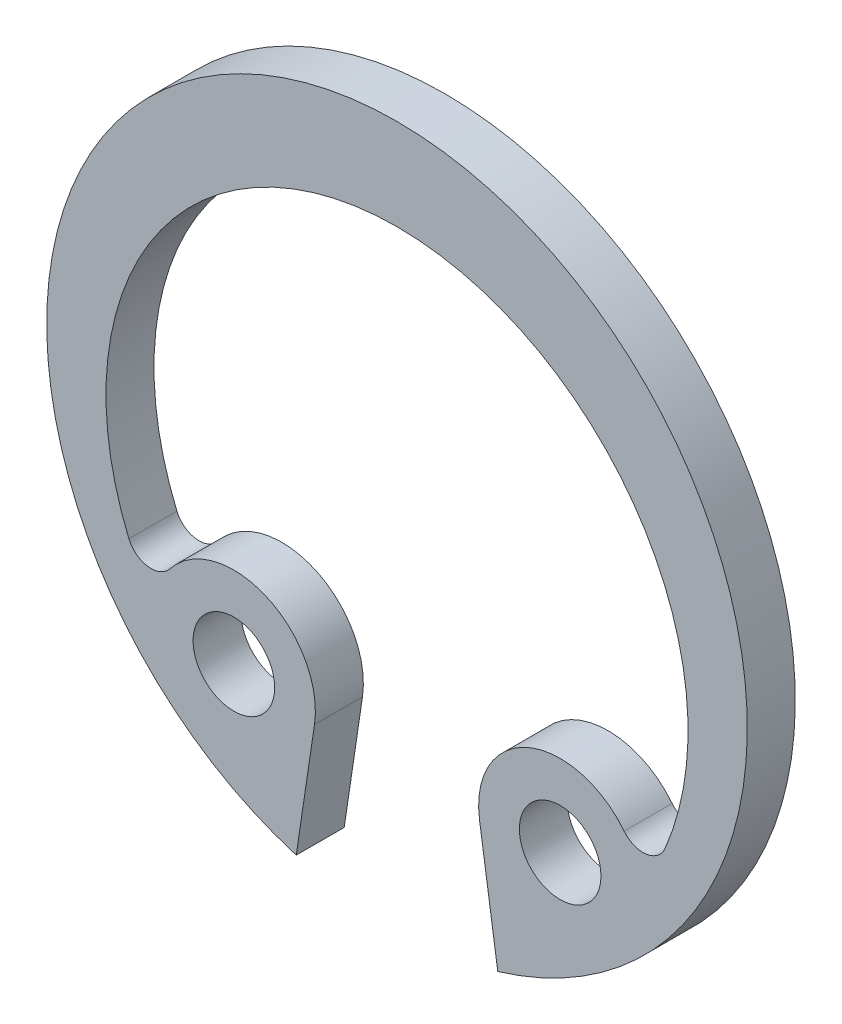
ISO-10303-21;
HEADER;
FILE_DESCRIPTION(('STEP AP214'),'2;1');
FILE_NAME('part.step','',(''),(''),'','','');
FILE_SCHEMA(('AUTOMOTIVE_DESIGN { 1 0 10303 214 1 1 1 1 }'));
ENDSEC;
DATA;
#1=APPLICATION_CONTEXT('core data for automotive mechanical design processes');
#2=APPLICATION_PROTOCOL_DEFINITION('international standard','automotive_design',2000,#1);
#3=PRODUCT_CONTEXT('',#1,'mechanical');
#4=PRODUCT('Part','Part','',(#3));
#5=PRODUCT_RELATED_PRODUCT_CATEGORY('part','',(#4));
#6=PRODUCT_DEFINITION_FORMATION('','',#4);
#7=PRODUCT_DEFINITION_CONTEXT('part definition',#1,'design');
#8=PRODUCT_DEFINITION('design','',#6,#7);
#9=PRODUCT_DEFINITION_SHAPE('','',#8);
#10=(LENGTH_UNIT() NAMED_UNIT(*) SI_UNIT(.MILLI.,.METRE.));
#11=(NAMED_UNIT(*) PLANE_ANGLE_UNIT() SI_UNIT($,.RADIAN.));
#12=(NAMED_UNIT(*) SI_UNIT($,.STERADIAN.) SOLID_ANGLE_UNIT());
#13=UNCERTAINTY_MEASURE_WITH_UNIT(LENGTH_MEASURE(1.E-05),#10,'distance_accuracy_value','');
#14=(GEOMETRIC_REPRESENTATION_CONTEXT(3) GLOBAL_UNCERTAINTY_ASSIGNED_CONTEXT((#13)) GLOBAL_UNIT_ASSIGNED_CONTEXT((#10,
#11,#12)) REPRESENTATION_CONTEXT('',''));
#15=CARTESIAN_POINT('',(0.,0.,0.));
#16=DIRECTION('',(0.,0.,1.));
#17=DIRECTION('',(1.,0.,0.));
#18=AXIS2_PLACEMENT_3D('',#15,#16,#17);
#19=CARTESIAN_POINT('',(-3.4,-4.19417934972832,1.));
#20=DIRECTION('',(0.,0.,1.));
#21=DIRECTION('',(1.,0.,0.));
#22=AXIS2_PLACEMENT_3D('',#19,#20,#21);
#23=PLANE('',#22);
#24=CARTESIAN_POINT('',(-3.4,-4.19417934972832,1.));
#25=DIRECTION('',(0.,0.,1.));
#26=DIRECTION('',(1.,0.,0.));
#27=AXIS2_PLACEMENT_3D('',#24,#25,#26);
#28=CIRCLE('',#27,0.85);
#29=CARTESIAN_POINT('',(-2.55,-4.19417934972832,1.));
#30=VERTEX_POINT('',#29);
#31=EDGE_CURVE('E135',#30,#30,#28,.T.);
#32=ORIENTED_EDGE('',*,*,#31,.F.);
#33=EDGE_LOOP('',(#32));
#34=FACE_BOUND('',#33,.T.);
#35=CARTESIAN_POINT('',(-3.4,-4.19417934972832,1.));
#36=DIRECTION('',(0.,0.,1.));
#37=DIRECTION('',(1.,0.,0.));
#38=AXIS2_PLACEMENT_3D('',#35,#36,#37);
#39=CIRCLE('',#38,1.69917960598529);
#40=CARTESIAN_POINT('',(-1.71948441497949,-4.44533408669246,1.));
#41=VERTEX_POINT('',#40);
#42=CARTESIAN_POINT('',(-4.7335953855741,-3.14121463950685,1.));
#43=VERTEX_POINT('',#42);
#44=EDGE_CURVE('E146',#41,#43,#39,.T.);
#45=ORIENTED_EDGE('',*,*,#44,.T.);
#46=CARTESIAN_POINT('',(-5.12601870000083,-2.83136961002543,1.));
#47=DIRECTION('',(0.,0.,-1.));
#48=DIRECTION('',(1.,0.,0.));
#49=AXIS2_PLACEMENT_3D('',#46,#47,#48);
#50=CIRCLE('',#49,0.5);
#51=CARTESIAN_POINT('',(-5.58657743315455,-3.02601198289384,1.));
#52=VERTEX_POINT('',#51);
#53=EDGE_CURVE('E94',#43,#52,#50,.T.);
#54=ORIENTED_EDGE('',*,*,#53,.T.);
#55=CARTESIAN_POINT('',(0.,-0.665000000000001,1.));
#56=DIRECTION('',(0.,0.,-1.));
#57=DIRECTION('',(1.,0.,0.));
#58=AXIS2_PLACEMENT_3D('',#55,#56,#57);
#59=CIRCLE('',#58,6.065);
#60=CARTESIAN_POINT('',(5.58657743315455,-3.02601198289384,1.));
#61=VERTEX_POINT('',#60);
#62=EDGE_CURVE('E161',#52,#61,#59,.T.);
#63=ORIENTED_EDGE('',*,*,#62,.T.);
#64=CARTESIAN_POINT('',(5.12601870000083,-2.83136961002543,1.));
#65=DIRECTION('',(0.,0.,-1.));
#66=DIRECTION('',(-1.,0.,0.));
#67=AXIS2_PLACEMENT_3D('',#64,#65,#66);
#68=CIRCLE('',#67,0.5);
#69=CARTESIAN_POINT('',(4.7335953855741,-3.14121463950685,1.));
#70=VERTEX_POINT('',#69);
#71=EDGE_CURVE('E174',#61,#70,#68,.T.);
#72=ORIENTED_EDGE('',*,*,#71,.T.);
#73=CARTESIAN_POINT('',(3.4,-4.19417934972832,1.));
#74=DIRECTION('',(0.,0.,1.));
#75=DIRECTION('',(1.,0.,0.));
#76=AXIS2_PLACEMENT_3D('',#73,#74,#75);
#77=CIRCLE('',#76,1.69917960598529);
#78=CARTESIAN_POINT('',(1.71948441497949,-4.44533408669246,1.));
#79=VERTEX_POINT('',#78);
#80=EDGE_CURVE('E113',#70,#79,#77,.T.);
#81=ORIENTED_EDGE('',*,*,#80,.T.);
#82=DIRECTION('',(0.147809411129611,-0.989015863361917,0.));
#83=VECTOR('',#82,1.);
#84=CARTESIAN_POINT('',(1.71948441497949,-4.44533408669246,1.));
#85=LINE('',#84,#83);
#86=CARTESIAN_POINT('',(2.1,-6.99142331717941,1.));
#87=VERTEX_POINT('',#86);
#88=EDGE_CURVE('E107',#79,#87,#85,.T.);
#89=ORIENTED_EDGE('',*,*,#88,.T.);
#90=CARTESIAN_POINT('',(0.,0.,1.));
#91=DIRECTION('',(0.,0.,1.));
#92=DIRECTION('',(1.,0.,0.));
#93=AXIS2_PLACEMENT_3D('',#90,#91,#92);
#94=CIRCLE('',#93,7.3);
#95=CARTESIAN_POINT('',(-2.1,-6.99142331717941,1.));
#96=VERTEX_POINT('',#95);
#97=EDGE_CURVE('E111',#87,#96,#94,.T.);
#98=ORIENTED_EDGE('',*,*,#97,.T.);
#99=DIRECTION('',(0.147809411129611,0.989015863361917,0.));
#100=VECTOR('',#99,1.);
#101=CARTESIAN_POINT('',(-1.71948441497949,-4.44533408669246,1.));
#102=LINE('',#101,#100);
#103=EDGE_CURVE('E51',#96,#41,#102,.T.);
#104=ORIENTED_EDGE('',*,*,#103,.T.);
#105=EDGE_LOOP('',(#45,#54,#63,#72,#81,#89,#98,#104));
#106=FACE_BOUND('',#105,.T.);
#107=CARTESIAN_POINT('',(3.4,-4.19417934972832,1.));
#108=DIRECTION('',(0.,0.,1.));
#109=DIRECTION('',(1.,0.,0.));
#110=AXIS2_PLACEMENT_3D('',#107,#108,#109);
#111=CIRCLE('',#110,0.85);
#112=CARTESIAN_POINT('',(4.25,-4.19417934972832,1.));
#113=VERTEX_POINT('',#112);
#114=EDGE_CURVE('E183',#113,#113,#111,.T.);
#115=ORIENTED_EDGE('',*,*,#114,.F.);
#116=EDGE_LOOP('',(#115));
#117=FACE_BOUND('',#116,.T.);
#118=ADVANCED_FACE('F34',(#34,#106,#117),#23,.T.);
#119=CARTESIAN_POINT('',(-3.4,-4.19417934972832,0.));
#120=DIRECTION('',(0.,0.,1.));
#121=DIRECTION('',(1.,0.,0.));
#122=AXIS2_PLACEMENT_3D('',#119,#120,#121);
#123=PLANE('',#122);
#124=CARTESIAN_POINT('',(-3.4,-4.19417934972832,0.));
#125=DIRECTION('',(0.,0.,1.));
#126=DIRECTION('',(1.,0.,0.));
#127=AXIS2_PLACEMENT_3D('',#124,#125,#126);
#128=CIRCLE('',#127,0.85);
#129=CARTESIAN_POINT('',(-2.55,-4.19417934972832,0.));
#130=VERTEX_POINT('',#129);
#131=EDGE_CURVE('E180',#130,#130,#128,.T.);
#132=ORIENTED_EDGE('',*,*,#131,.T.);
#133=EDGE_LOOP('',(#132));
#134=FACE_BOUND('',#133,.T.);
#135=CARTESIAN_POINT('',(-3.4,-4.19417934972832,0.));
#136=DIRECTION('',(0.,0.,1.));
#137=DIRECTION('',(1.,0.,0.));
#138=AXIS2_PLACEMENT_3D('',#135,#136,#137);
#139=CIRCLE('',#138,1.69917960598529);
#140=CARTESIAN_POINT('',(-1.71948441497949,-4.44533408669246,0.));
#141=VERTEX_POINT('',#140);
#142=CARTESIAN_POINT('',(-4.7335953855741,-3.14121463950685,0.));
#143=VERTEX_POINT('',#142);
#144=EDGE_CURVE('E131',#141,#143,#139,.T.);
#145=ORIENTED_EDGE('',*,*,#144,.F.);
#146=DIRECTION('',(0.147809411129611,0.989015863361917,0.));
#147=VECTOR('',#146,1.);
#148=CARTESIAN_POINT('',(-1.71948441497949,-4.44533408669246,0.));
#149=LINE('',#148,#147);
#150=CARTESIAN_POINT('',(-2.1,-6.99142331717941,0.));
#151=VERTEX_POINT('',#150);
#152=EDGE_CURVE('E86',#151,#141,#149,.T.);
#153=ORIENTED_EDGE('',*,*,#152,.F.);
#154=CARTESIAN_POINT('',(0.,0.,0.));
#155=DIRECTION('',(0.,0.,1.));
#156=DIRECTION('',(1.,0.,0.));
#157=AXIS2_PLACEMENT_3D('',#154,#155,#156);
#158=CIRCLE('',#157,7.3);
#159=CARTESIAN_POINT('',(2.1,-6.99142331717941,0.));
#160=VERTEX_POINT('',#159);
#161=EDGE_CURVE('E80',#160,#151,#158,.T.);
#162=ORIENTED_EDGE('',*,*,#161,.F.);
#163=DIRECTION('',(0.147809411129611,-0.989015863361917,0.));
#164=VECTOR('',#163,1.);
#165=CARTESIAN_POINT('',(1.71948441497949,-4.44533408669246,0.));
#166=LINE('',#165,#164);
#167=CARTESIAN_POINT('',(1.71948441497949,-4.44533408669246,0.));
#168=VERTEX_POINT('',#167);
#169=EDGE_CURVE('E121',#168,#160,#166,.T.);
#170=ORIENTED_EDGE('',*,*,#169,.F.);
#171=CARTESIAN_POINT('',(3.4,-4.19417934972832,0.));
#172=DIRECTION('',(0.,0.,1.));
#173=DIRECTION('',(1.,0.,0.));
#174=AXIS2_PLACEMENT_3D('',#171,#172,#173);
#175=CIRCLE('',#174,1.69917960598529);
#176=CARTESIAN_POINT('',(4.7335953855741,-3.14121463950685,0.));
#177=VERTEX_POINT('',#176);
#178=EDGE_CURVE('E141',#177,#168,#175,.T.);
#179=ORIENTED_EDGE('',*,*,#178,.F.);
#180=CARTESIAN_POINT('',(5.12601870000083,-2.83136961002543,0.));
#181=DIRECTION('',(0.,0.,-1.));
#182=DIRECTION('',(-1.,0.,0.));
#183=AXIS2_PLACEMENT_3D('',#180,#181,#182);
#184=CIRCLE('',#183,0.5);
#185=CARTESIAN_POINT('',(5.58657743315455,-3.02601198289384,0.));
#186=VERTEX_POINT('',#185);
#187=EDGE_CURVE('E139',#186,#177,#184,.T.);
#188=ORIENTED_EDGE('',*,*,#187,.F.);
#189=CARTESIAN_POINT('',(0.,-0.665000000000001,0.));
#190=DIRECTION('',(0.,0.,-1.));
#191=DIRECTION('',(1.,0.,0.));
#192=AXIS2_PLACEMENT_3D('',#189,#190,#191);
#193=CIRCLE('',#192,6.065);
#194=CARTESIAN_POINT('',(-5.58657743315455,-3.02601198289384,0.));
#195=VERTEX_POINT('',#194);
#196=EDGE_CURVE('E137',#195,#186,#193,.T.);
#197=ORIENTED_EDGE('',*,*,#196,.F.);
#198=CARTESIAN_POINT('',(-5.12601870000083,-2.83136961002543,0.));
#199=DIRECTION('',(0.,0.,-1.));
#200=DIRECTION('',(1.,0.,0.));
#201=AXIS2_PLACEMENT_3D('',#198,#199,#200);
#202=CIRCLE('',#201,0.5);
#203=EDGE_CURVE('E134',#143,#195,#202,.T.);
#204=ORIENTED_EDGE('',*,*,#203,.F.);
#205=EDGE_LOOP('',(#145,#153,#162,#170,#179,#188,#197,#204));
#206=FACE_BOUND('',#205,.T.);
#207=CARTESIAN_POINT('',(3.4,-4.19417934972832,0.));
#208=DIRECTION('',(0.,0.,1.));
#209=DIRECTION('',(1.,0.,0.));
#210=AXIS2_PLACEMENT_3D('',#207,#208,#209);
#211=CIRCLE('',#210,0.85);
#212=CARTESIAN_POINT('',(4.25,-4.19417934972832,0.));
#213=VERTEX_POINT('',#212);
#214=EDGE_CURVE('E186',#213,#213,#211,.T.);
#215=ORIENTED_EDGE('',*,*,#214,.T.);
#216=EDGE_LOOP('',(#215));
#217=FACE_BOUND('',#216,.T.);
#218=ADVANCED_FACE('F165',(#134,#206,#217),#123,.F.);
#219=CARTESIAN_POINT('',(-3.4,-4.19417934972832,1.));
#220=DIRECTION('',(0.,0.,-1.));
#221=DIRECTION('',(-1.,0.,0.));
#222=AXIS2_PLACEMENT_3D('',#219,#220,#221);
#223=CYLINDRICAL_SURFACE('',#222,1.69917960598529);
#224=ORIENTED_EDGE('',*,*,#144,.T.);
#225=DIRECTION('',(0.,0.,-1.));
#226=VECTOR('',#225,1.);
#227=CARTESIAN_POINT('',(-4.7335953855741,-3.14121463950685,1.));
#228=LINE('',#227,#226);
#229=EDGE_CURVE('E11',#43,#143,#228,.T.);
#230=ORIENTED_EDGE('',*,*,#229,.F.);
#231=ORIENTED_EDGE('',*,*,#44,.F.);
#232=DIRECTION('',(0.,0.,-1.));
#233=VECTOR('',#232,1.);
#234=CARTESIAN_POINT('',(-1.71948441497949,-4.44533408669246,1.));
#235=LINE('',#234,#233);
#236=EDGE_CURVE('E127',#41,#141,#235,.T.);
#237=ORIENTED_EDGE('',*,*,#236,.T.);
#238=EDGE_LOOP('',(#224,#230,#231,#237));
#239=FACE_BOUND('',#238,.T.);
#240=ADVANCED_FACE('F36',(#239),#223,.T.);
#241=CARTESIAN_POINT('',(-5.12601870000083,-2.83136961002543,1.));
#242=DIRECTION('',(0.,0.,-1.));
#243=DIRECTION('',(-1.,0.,0.));
#244=AXIS2_PLACEMENT_3D('',#241,#242,#243);
#245=CYLINDRICAL_SURFACE('',#244,0.5);
#246=ORIENTED_EDGE('',*,*,#203,.T.);
#247=DIRECTION('',(0.,0.,-1.));
#248=VECTOR('',#247,1.);
#249=CARTESIAN_POINT('',(-5.58657743315455,-3.02601198289384,1.));
#250=LINE('',#249,#248);
#251=EDGE_CURVE('E43',#52,#195,#250,.T.);
#252=ORIENTED_EDGE('',*,*,#251,.F.);
#253=ORIENTED_EDGE('',*,*,#53,.F.);
#254=ORIENTED_EDGE('',*,*,#229,.T.);
#255=EDGE_LOOP('',(#246,#252,#253,#254));
#256=FACE_BOUND('',#255,.T.);
#257=ADVANCED_FACE('F219',(#256),#245,.F.);
#258=CARTESIAN_POINT('',(0.,-0.665000000000001,1.));
#259=DIRECTION('',(0.,0.,-1.));
#260=DIRECTION('',(-1.,0.,0.));
#261=AXIS2_PLACEMENT_3D('',#258,#259,#260);
#262=CYLINDRICAL_SURFACE('',#261,6.065);
#263=ORIENTED_EDGE('',*,*,#196,.T.);
#264=DIRECTION('',(0.,0.,-1.));
#265=VECTOR('',#264,1.);
#266=CARTESIAN_POINT('',(5.58657743315455,-3.02601198289384,1.));
#267=LINE('',#266,#265);
#268=EDGE_CURVE('E153',#61,#186,#267,.T.);
#269=ORIENTED_EDGE('',*,*,#268,.F.);
#270=ORIENTED_EDGE('',*,*,#62,.F.);
#271=ORIENTED_EDGE('',*,*,#251,.T.);
#272=EDGE_LOOP('',(#263,#269,#270,#271));
#273=FACE_BOUND('',#272,.T.);
#274=ADVANCED_FACE('F159',(#273),#262,.F.);
#275=CARTESIAN_POINT('',(5.12601870000083,-2.83136961002543,1.));
#276=DIRECTION('',(0.,0.,-1.));
#277=DIRECTION('',(-1.,0.,0.));
#278=AXIS2_PLACEMENT_3D('',#275,#276,#277);
#279=CYLINDRICAL_SURFACE('',#278,0.5);
#280=ORIENTED_EDGE('',*,*,#187,.T.);
#281=DIRECTION('',(0.,0.,-1.));
#282=VECTOR('',#281,1.);
#283=CARTESIAN_POINT('',(4.7335953855741,-3.14121463950685,1.));
#284=LINE('',#283,#282);
#285=EDGE_CURVE('E150',#70,#177,#284,.T.);
#286=ORIENTED_EDGE('',*,*,#285,.F.);
#287=ORIENTED_EDGE('',*,*,#71,.F.);
#288=ORIENTED_EDGE('',*,*,#268,.T.);
#289=EDGE_LOOP('',(#280,#286,#287,#288));
#290=FACE_BOUND('',#289,.T.);
#291=ADVANCED_FACE('F170',(#290),#279,.F.);
#292=CARTESIAN_POINT('',(3.4,-4.19417934972832,1.));
#293=DIRECTION('',(0.,0.,-1.));
#294=DIRECTION('',(-1.,0.,0.));
#295=AXIS2_PLACEMENT_3D('',#292,#293,#294);
#296=CYLINDRICAL_SURFACE('',#295,1.69917960598529);
#297=ORIENTED_EDGE('',*,*,#178,.T.);
#298=DIRECTION('',(0.,0.,-1.));
#299=VECTOR('',#298,1.);
#300=CARTESIAN_POINT('',(1.71948441497949,-4.44533408669246,1.));
#301=LINE('',#300,#299);
#302=EDGE_CURVE('E122',#79,#168,#301,.T.);
#303=ORIENTED_EDGE('',*,*,#302,.F.);
#304=ORIENTED_EDGE('',*,*,#80,.F.);
#305=ORIENTED_EDGE('',*,*,#285,.T.);
#306=EDGE_LOOP('',(#297,#303,#304,#305));
#307=FACE_BOUND('',#306,.T.);
#308=ADVANCED_FACE('F173',(#307),#296,.T.);
#309=CARTESIAN_POINT('',(1.71948441497949,-4.44533408669246,1.));
#310=DIRECTION('',(0.989015863361917,0.147809411129611,0.));
#311=DIRECTION('',(-0.147809411129611,0.989015863361917,0.));
#312=AXIS2_PLACEMENT_3D('',#309,#310,#311);
#313=PLANE('',#312);
#314=ORIENTED_EDGE('',*,*,#169,.T.);
#315=DIRECTION('',(0.,0.,-1.));
#316=VECTOR('',#315,1.);
#317=CARTESIAN_POINT('',(2.1,-6.99142331717941,1.));
#318=LINE('',#317,#316);
#319=EDGE_CURVE('E118',#87,#160,#318,.T.);
#320=ORIENTED_EDGE('',*,*,#319,.F.);
#321=ORIENTED_EDGE('',*,*,#88,.F.);
#322=ORIENTED_EDGE('',*,*,#302,.T.);
#323=EDGE_LOOP('',(#314,#320,#321,#322));
#324=FACE_BOUND('',#323,.T.);
#325=ADVANCED_FACE('F119',(#324),#313,.F.);
#326=CARTESIAN_POINT('',(0.,0.,1.));
#327=DIRECTION('',(0.,0.,-1.));
#328=DIRECTION('',(-1.,0.,0.));
#329=AXIS2_PLACEMENT_3D('',#326,#327,#328);
#330=CYLINDRICAL_SURFACE('',#329,7.3);
#331=ORIENTED_EDGE('',*,*,#161,.T.);
#332=DIRECTION('',(0.,0.,-1.));
#333=VECTOR('',#332,1.);
#334=CARTESIAN_POINT('',(-2.1,-6.99142331717941,1.));
#335=LINE('',#334,#333);
#336=EDGE_CURVE('E123',#96,#151,#335,.T.);
#337=ORIENTED_EDGE('',*,*,#336,.F.);
#338=ORIENTED_EDGE('',*,*,#97,.F.);
#339=ORIENTED_EDGE('',*,*,#319,.T.);
#340=EDGE_LOOP('',(#331,#337,#338,#339));
#341=FACE_BOUND('',#340,.T.);
#342=ADVANCED_FACE('F125',(#341),#330,.T.);
#343=CARTESIAN_POINT('',(-1.71948441497949,-4.44533408669246,1.));
#344=DIRECTION('',(-0.989015863361917,0.147809411129611,0.));
#345=DIRECTION('',(-0.147809411129611,-0.989015863361917,0.));
#346=AXIS2_PLACEMENT_3D('',#343,#344,#345);
#347=PLANE('',#346);
#348=ORIENTED_EDGE('',*,*,#152,.T.);
#349=ORIENTED_EDGE('',*,*,#236,.F.);
#350=ORIENTED_EDGE('',*,*,#103,.F.);
#351=ORIENTED_EDGE('',*,*,#336,.T.);
#352=EDGE_LOOP('',(#348,#349,#350,#351));
#353=FACE_BOUND('',#352,.T.);
#354=ADVANCED_FACE('F207',(#353),#347,.F.);
#355=CARTESIAN_POINT('',(-3.4,-4.19417934972832,1.));
#356=DIRECTION('',(0.,0.,-1.));
#357=DIRECTION('',(-1.,0.,0.));
#358=AXIS2_PLACEMENT_3D('',#355,#356,#357);
#359=CYLINDRICAL_SURFACE('',#358,0.85);
#360=ORIENTED_EDGE('',*,*,#31,.T.);
#361=EDGE_LOOP('',(#360));
#362=FACE_BOUND('',#361,.T.);
#363=ORIENTED_EDGE('',*,*,#131,.F.);
#364=EDGE_LOOP('',(#363));
#365=FACE_BOUND('',#364,.T.);
#366=ADVANCED_FACE('F204',(#362,#365),#359,.F.);
#367=CARTESIAN_POINT('',(3.4,-4.19417934972832,1.));
#368=DIRECTION('',(0.,0.,-1.));
#369=DIRECTION('',(-1.,0.,0.));
#370=AXIS2_PLACEMENT_3D('',#367,#368,#369);
#371=CYLINDRICAL_SURFACE('',#370,0.85);
#372=ORIENTED_EDGE('',*,*,#114,.T.);
#373=EDGE_LOOP('',(#372));
#374=FACE_BOUND('',#373,.T.);
#375=ORIENTED_EDGE('',*,*,#214,.F.);
#376=EDGE_LOOP('',(#375));
#377=FACE_BOUND('',#376,.T.);
#378=ADVANCED_FACE('F192',(#374,#377),#371,.F.);
#379=CLOSED_SHELL('',(#118,#218,#240,#257,#274,#291,#308,#325,#342,#354,#366,#378));
#380=MANIFOLD_SOLID_BREP('B2',#379);
#381=ADVANCED_BREP_SHAPE_REPRESENTATION('',(#18,#380),#14);
#382=SHAPE_DEFINITION_REPRESENTATION(#9,#381);
ENDSEC;
END-ISO-10303-21;
